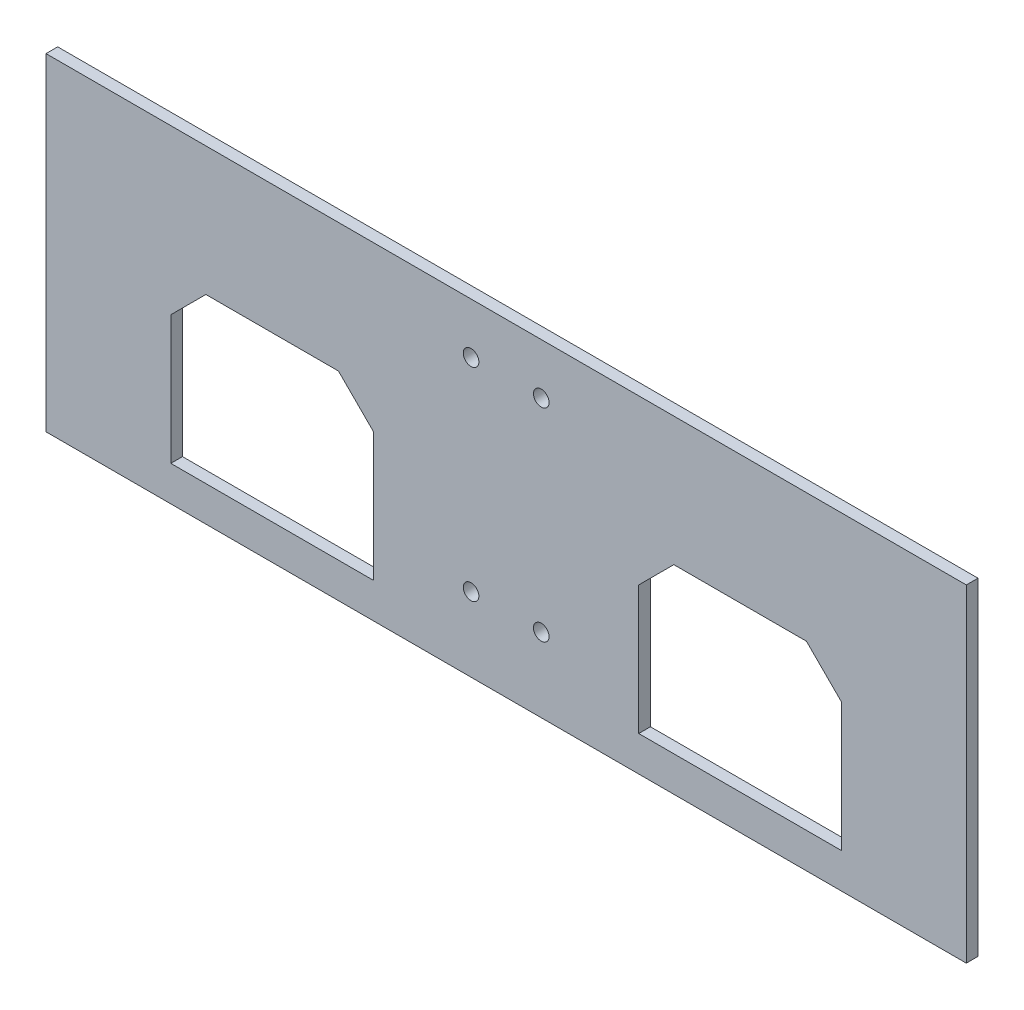
ISO-10303-21;
HEADER;
FILE_DESCRIPTION(('STEP AP214'),'2;1');
FILE_NAME('part.step','',(''),(''),'','','');
FILE_SCHEMA(('AUTOMOTIVE_DESIGN { 1 0 10303 214 1 1 1 1 }'));
ENDSEC;
DATA;
#1=APPLICATION_CONTEXT('core data for automotive mechanical design processes');
#2=APPLICATION_PROTOCOL_DEFINITION('international standard','automotive_design',2000,#1);
#3=PRODUCT_CONTEXT('',#1,'mechanical');
#4=PRODUCT('Part','Part','',(#3));
#5=PRODUCT_RELATED_PRODUCT_CATEGORY('part','',(#4));
#6=PRODUCT_DEFINITION_FORMATION('','',#4);
#7=PRODUCT_DEFINITION_CONTEXT('part definition',#1,'design');
#8=PRODUCT_DEFINITION('design','',#6,#7);
#9=PRODUCT_DEFINITION_SHAPE('','',#8);
#10=(LENGTH_UNIT() NAMED_UNIT(*) SI_UNIT(.MILLI.,.METRE.));
#11=(NAMED_UNIT(*) PLANE_ANGLE_UNIT() SI_UNIT($,.RADIAN.));
#12=(NAMED_UNIT(*) SI_UNIT($,.STERADIAN.) SOLID_ANGLE_UNIT());
#13=UNCERTAINTY_MEASURE_WITH_UNIT(LENGTH_MEASURE(1.E-05),#10,'distance_accuracy_value','');
#14=(GEOMETRIC_REPRESENTATION_CONTEXT(3) GLOBAL_UNCERTAINTY_ASSIGNED_CONTEXT((#13)) GLOBAL_UNIT_ASSIGNED_CONTEXT((#10,
#11,#12)) REPRESENTATION_CONTEXT('',''));
#15=CARTESIAN_POINT('',(0.,0.,0.));
#16=DIRECTION('',(0.,0.,1.));
#17=DIRECTION('',(1.,0.,0.));
#18=AXIS2_PLACEMENT_3D('',#15,#16,#17);
#19=CARTESIAN_POINT('',(-118.,39.,3.));
#20=DIRECTION('',(1.,0.,0.));
#21=DIRECTION('',(0.,1.,0.));
#22=AXIS2_PLACEMENT_3D('',#19,#20,#21);
#23=PLANE('',#22);
#24=DIRECTION('',(0.,-1.,0.));
#25=VECTOR('',#24,1.);
#26=CARTESIAN_POINT('',(-118.,39.,0.));
#27=LINE('',#26,#25);
#28=CARTESIAN_POINT('',(-118.,39.,0.));
#29=VERTEX_POINT('',#28);
#30=CARTESIAN_POINT('',(-118.,-45.,0.));
#31=VERTEX_POINT('',#30);
#32=EDGE_CURVE('E276',#29,#31,#27,.T.);
#33=ORIENTED_EDGE('',*,*,#32,.T.);
#34=DIRECTION('',(0.,0.,1.));
#35=VECTOR('',#34,1.);
#36=CARTESIAN_POINT('',(-118.,-45.,0.));
#37=LINE('',#36,#35);
#38=CARTESIAN_POINT('',(-118.,-45.,3.));
#39=VERTEX_POINT('',#38);
#40=EDGE_CURVE('E252',#31,#39,#37,.T.);
#41=ORIENTED_EDGE('',*,*,#40,.T.);
#42=DIRECTION('',(0.,-1.,0.));
#43=VECTOR('',#42,1.);
#44=CARTESIAN_POINT('',(-118.,39.,3.));
#45=LINE('',#44,#43);
#46=CARTESIAN_POINT('',(-118.,39.,3.));
#47=VERTEX_POINT('',#46);
#48=EDGE_CURVE('E285',#47,#39,#45,.T.);
#49=ORIENTED_EDGE('',*,*,#48,.F.);
#50=DIRECTION('',(0.,0.,-1.));
#51=VECTOR('',#50,1.);
#52=CARTESIAN_POINT('',(-118.,39.,3.));
#53=LINE('',#52,#51);
#54=EDGE_CURVE('E46',#47,#29,#53,.T.);
#55=ORIENTED_EDGE('',*,*,#54,.T.);
#56=EDGE_LOOP('',(#33,#41,#49,#55));
#57=FACE_BOUND('',#56,.T.);
#58=ADVANCED_FACE('F39',(#57),#23,.F.);
#59=CARTESIAN_POINT('',(118.,39.,3.));
#60=DIRECTION('',(-1.,0.,0.));
#61=DIRECTION('',(0.,-1.,0.));
#62=AXIS2_PLACEMENT_3D('',#59,#60,#61);
#63=PLANE('',#62);
#64=DIRECTION('',(0.,1.,0.));
#65=VECTOR('',#64,1.);
#66=CARTESIAN_POINT('',(118.,39.,0.));
#67=LINE('',#66,#65);
#68=CARTESIAN_POINT('',(118.,-45.,0.));
#69=VERTEX_POINT('',#68);
#70=CARTESIAN_POINT('',(118.,39.,0.));
#71=VERTEX_POINT('',#70);
#72=EDGE_CURVE('E293',#69,#71,#67,.T.);
#73=ORIENTED_EDGE('',*,*,#72,.T.);
#74=DIRECTION('',(0.,0.,-1.));
#75=VECTOR('',#74,1.);
#76=CARTESIAN_POINT('',(118.,39.,3.));
#77=LINE('',#76,#75);
#78=CARTESIAN_POINT('',(118.,39.,3.));
#79=VERTEX_POINT('',#78);
#80=EDGE_CURVE('E11',#79,#71,#77,.T.);
#81=ORIENTED_EDGE('',*,*,#80,.F.);
#82=DIRECTION('',(0.,1.,0.));
#83=VECTOR('',#82,1.);
#84=CARTESIAN_POINT('',(118.,39.,3.));
#85=LINE('',#84,#83);
#86=CARTESIAN_POINT('',(118.,-45.,3.));
#87=VERTEX_POINT('',#86);
#88=EDGE_CURVE('E287',#87,#79,#85,.T.);
#89=ORIENTED_EDGE('',*,*,#88,.F.);
#90=DIRECTION('',(0.,0.,1.));
#91=VECTOR('',#90,1.);
#92=CARTESIAN_POINT('',(118.,-45.,0.));
#93=LINE('',#92,#91);
#94=EDGE_CURVE('E255',#69,#87,#93,.T.);
#95=ORIENTED_EDGE('',*,*,#94,.F.);
#96=EDGE_LOOP('',(#73,#81,#89,#95));
#97=FACE_BOUND('',#96,.T.);
#98=ADVANCED_FACE('F315',(#97),#63,.F.);
#99=CARTESIAN_POINT('',(-118.,39.,3.));
#100=DIRECTION('',(0.,-1.,0.));
#101=DIRECTION('',(1.,0.,0.));
#102=AXIS2_PLACEMENT_3D('',#99,#100,#101);
#103=PLANE('',#102);
#104=DIRECTION('',(-1.,0.,0.));
#105=VECTOR('',#104,1.);
#106=CARTESIAN_POINT('',(-118.,39.,0.));
#107=LINE('',#106,#105);
#108=EDGE_CURVE('E288',#71,#29,#107,.T.);
#109=ORIENTED_EDGE('',*,*,#108,.T.);
#110=ORIENTED_EDGE('',*,*,#54,.F.);
#111=DIRECTION('',(-1.,0.,0.));
#112=VECTOR('',#111,1.);
#113=CARTESIAN_POINT('',(-118.,39.,3.));
#114=LINE('',#113,#112);
#115=EDGE_CURVE('E290',#79,#47,#114,.T.);
#116=ORIENTED_EDGE('',*,*,#115,.F.);
#117=ORIENTED_EDGE('',*,*,#80,.T.);
#118=EDGE_LOOP('',(#109,#110,#116,#117));
#119=FACE_BOUND('',#118,.T.);
#120=ADVANCED_FACE('F313',(#119),#103,.F.);
#121=CARTESIAN_POINT('',(0.,0.,3.));
#122=DIRECTION('',(0.,0.,-1.));
#123=DIRECTION('',(-1.,0.,0.));
#124=AXIS2_PLACEMENT_3D('',#121,#122,#123);
#125=PLANE('',#124);
#126=DIRECTION('',(-1.,0.,0.));
#127=VECTOR('',#126,1.);
#128=CARTESIAN_POINT('',(43.,5.99999999999998,3.));
#129=LINE('',#128,#127);
#130=CARTESIAN_POINT('',(77.,5.99999999999998,3.));
#131=VERTEX_POINT('',#130);
#132=CARTESIAN_POINT('',(43.,5.99999999999998,3.));
#133=VERTEX_POINT('',#132);
#134=EDGE_CURVE('E176',#131,#133,#129,.T.);
#135=ORIENTED_EDGE('',*,*,#134,.F.);
#136=DIRECTION('',(-0.707106781186548,0.707106781186547,0.));
#137=VECTOR('',#136,1.);
#138=CARTESIAN_POINT('',(86.,-3.,3.));
#139=LINE('',#138,#137);
#140=CARTESIAN_POINT('',(86.,-3.,3.));
#141=VERTEX_POINT('',#140);
#142=EDGE_CURVE('E53',#141,#131,#139,.T.);
#143=ORIENTED_EDGE('',*,*,#142,.F.);
#144=DIRECTION('',(0.,1.,0.));
#145=VECTOR('',#144,1.);
#146=CARTESIAN_POINT('',(86.,-36.,3.));
#147=LINE('',#146,#145);
#148=CARTESIAN_POINT('',(86.,-36.,3.));
#149=VERTEX_POINT('',#148);
#150=EDGE_CURVE('E168',#149,#141,#147,.T.);
#151=ORIENTED_EDGE('',*,*,#150,.F.);
#152=DIRECTION('',(1.,0.,0.));
#153=VECTOR('',#152,1.);
#154=CARTESIAN_POINT('',(34.,-36.,3.));
#155=LINE('',#154,#153);
#156=CARTESIAN_POINT('',(34.,-36.,3.));
#157=VERTEX_POINT('',#156);
#158=EDGE_CURVE('E189',#157,#149,#155,.T.);
#159=ORIENTED_EDGE('',*,*,#158,.F.);
#160=DIRECTION('',(0.,-1.,0.));
#161=VECTOR('',#160,1.);
#162=CARTESIAN_POINT('',(34.,-36.,3.));
#163=LINE('',#162,#161);
#164=CARTESIAN_POINT('',(34.,-3.00000000000002,3.));
#165=VERTEX_POINT('',#164);
#166=EDGE_CURVE('E186',#165,#157,#163,.T.);
#167=ORIENTED_EDGE('',*,*,#166,.F.);
#168=DIRECTION('',(-0.707106781186548,-0.707106781186547,0.));
#169=VECTOR('',#168,1.);
#170=CARTESIAN_POINT('',(34.,-3.00000000000002,3.));
#171=LINE('',#170,#169);
#172=EDGE_CURVE('E183',#133,#165,#171,.T.);
#173=ORIENTED_EDGE('',*,*,#172,.F.);
#174=EDGE_LOOP('',(#135,#143,#151,#159,#167,#173));
#175=FACE_BOUND('',#174,.T.);
#176=DIRECTION('',(-0.707106781186548,-0.707106781186547,0.));
#177=VECTOR('',#176,1.);
#178=CARTESIAN_POINT('',(-86.,-3.,3.));
#179=LINE('',#178,#177);
#180=CARTESIAN_POINT('',(-77.,5.99999999999998,3.));
#181=VERTEX_POINT('',#180);
#182=CARTESIAN_POINT('',(-86.,-3.,3.));
#183=VERTEX_POINT('',#182);
#184=EDGE_CURVE('E218',#181,#183,#179,.T.);
#185=ORIENTED_EDGE('',*,*,#184,.F.);
#186=DIRECTION('',(-1.,0.,0.));
#187=VECTOR('',#186,1.);
#188=CARTESIAN_POINT('',(-43.,5.99999999999998,3.));
#189=LINE('',#188,#187);
#190=CARTESIAN_POINT('',(-43.,5.99999999999998,3.));
#191=VERTEX_POINT('',#190);
#192=EDGE_CURVE('E61',#191,#181,#189,.T.);
#193=ORIENTED_EDGE('',*,*,#192,.F.);
#194=DIRECTION('',(-0.707106781186548,0.707106781186547,0.));
#195=VECTOR('',#194,1.);
#196=CARTESIAN_POINT('',(-34.,-3.00000000000002,3.));
#197=LINE('',#196,#195);
#198=CARTESIAN_POINT('',(-34.,-3.00000000000002,3.));
#199=VERTEX_POINT('',#198);
#200=EDGE_CURVE('E230',#199,#191,#197,.T.);
#201=ORIENTED_EDGE('',*,*,#200,.F.);
#202=DIRECTION('',(0.,1.,0.));
#203=VECTOR('',#202,1.);
#204=CARTESIAN_POINT('',(-34.,-36.,3.));
#205=LINE('',#204,#203);
#206=CARTESIAN_POINT('',(-34.,-36.,3.));
#207=VERTEX_POINT('',#206);
#208=EDGE_CURVE('E227',#207,#199,#205,.T.);
#209=ORIENTED_EDGE('',*,*,#208,.F.);
#210=DIRECTION('',(1.,0.,0.));
#211=VECTOR('',#210,1.);
#212=CARTESIAN_POINT('',(-34.,-36.,3.));
#213=LINE('',#212,#211);
#214=CARTESIAN_POINT('',(-86.,-36.,3.));
#215=VERTEX_POINT('',#214);
#216=EDGE_CURVE('E224',#215,#207,#213,.T.);
#217=ORIENTED_EDGE('',*,*,#216,.F.);
#218=DIRECTION('',(0.,-1.,0.));
#219=VECTOR('',#218,1.);
#220=CARTESIAN_POINT('',(-86.,-36.,3.));
#221=LINE('',#220,#219);
#222=EDGE_CURVE('E221',#183,#215,#221,.T.);
#223=ORIENTED_EDGE('',*,*,#222,.F.);
#224=EDGE_LOOP('',(#185,#193,#201,#209,#217,#223));
#225=FACE_BOUND('',#224,.T.);
#226=CARTESIAN_POINT('',(9.,26.,3.));
#227=DIRECTION('',(0.,0.,-1.));
#228=DIRECTION('',(1.,0.,0.));
#229=AXIS2_PLACEMENT_3D('',#226,#227,#228);
#230=CIRCLE('',#229,2.);
#231=CARTESIAN_POINT('',(11.,26.,3.));
#232=VERTEX_POINT('',#231);
#233=EDGE_CURVE('E261',#232,#232,#230,.T.);
#234=ORIENTED_EDGE('',*,*,#233,.T.);
#235=EDGE_LOOP('',(#234));
#236=FACE_BOUND('',#235,.T.);
#237=CARTESIAN_POINT('',(-9.,26.,3.));
#238=DIRECTION('',(0.,0.,-1.));
#239=DIRECTION('',(1.,0.,0.));
#240=AXIS2_PLACEMENT_3D('',#237,#238,#239);
#241=CIRCLE('',#240,2.);
#242=CARTESIAN_POINT('',(-7.,26.,3.));
#243=VERTEX_POINT('',#242);
#244=EDGE_CURVE('E258',#243,#243,#241,.T.);
#245=ORIENTED_EDGE('',*,*,#244,.T.);
#246=EDGE_LOOP('',(#245));
#247=FACE_BOUND('',#246,.T.);
#248=CARTESIAN_POINT('',(9.,-26.,3.));
#249=DIRECTION('',(0.,0.,1.));
#250=DIRECTION('',(1.,0.,0.));
#251=AXIS2_PLACEMENT_3D('',#248,#249,#250);
#252=CIRCLE('',#251,2.);
#253=CARTESIAN_POINT('',(11.,-26.,3.));
#254=VERTEX_POINT('',#253);
#255=EDGE_CURVE('E273',#254,#254,#252,.T.);
#256=ORIENTED_EDGE('',*,*,#255,.F.);
#257=EDGE_LOOP('',(#256));
#258=FACE_BOUND('',#257,.T.);
#259=CARTESIAN_POINT('',(-9.,-26.,3.));
#260=DIRECTION('',(0.,0.,1.));
#261=DIRECTION('',(1.,0.,0.));
#262=AXIS2_PLACEMENT_3D('',#259,#260,#261);
#263=CIRCLE('',#262,2.);
#264=CARTESIAN_POINT('',(-7.,-26.,3.));
#265=VERTEX_POINT('',#264);
#266=EDGE_CURVE('E280',#265,#265,#263,.T.);
#267=ORIENTED_EDGE('',*,*,#266,.F.);
#268=EDGE_LOOP('',(#267));
#269=FACE_BOUND('',#268,.T.);
#270=ORIENTED_EDGE('',*,*,#48,.T.);
#271=DIRECTION('',(1.,0.,0.));
#272=VECTOR('',#271,1.);
#273=CARTESIAN_POINT('',(-118.,-45.,3.));
#274=LINE('',#273,#272);
#275=EDGE_CURVE('E162',#39,#87,#274,.T.);
#276=ORIENTED_EDGE('',*,*,#275,.T.);
#277=ORIENTED_EDGE('',*,*,#88,.T.);
#278=ORIENTED_EDGE('',*,*,#115,.T.);
#279=EDGE_LOOP('',(#270,#276,#277,#278));
#280=FACE_BOUND('',#279,.T.);
#281=ADVANCED_FACE('F311',(#175,#225,#236,#247,#258,#269,#280),#125,.F.);
#282=CARTESIAN_POINT('',(0.,0.,0.));
#283=DIRECTION('',(0.,0.,-1.));
#284=DIRECTION('',(-1.,0.,0.));
#285=AXIS2_PLACEMENT_3D('',#282,#283,#284);
#286=PLANE('',#285);
#287=DIRECTION('',(-0.707106781186548,0.707106781186547,0.));
#288=VECTOR('',#287,1.);
#289=CARTESIAN_POINT('',(86.,-3.,0.));
#290=LINE('',#289,#288);
#291=CARTESIAN_POINT('',(86.,-3.,0.));
#292=VERTEX_POINT('',#291);
#293=CARTESIAN_POINT('',(77.,5.99999999999998,0.));
#294=VERTEX_POINT('',#293);
#295=EDGE_CURVE('E166',#292,#294,#290,.T.);
#296=ORIENTED_EDGE('',*,*,#295,.T.);
#297=DIRECTION('',(-1.,0.,0.));
#298=VECTOR('',#297,1.);
#299=CARTESIAN_POINT('',(43.,5.99999999999998,0.));
#300=LINE('',#299,#298);
#301=CARTESIAN_POINT('',(43.,5.99999999999998,0.));
#302=VERTEX_POINT('',#301);
#303=EDGE_CURVE('E152',#294,#302,#300,.T.);
#304=ORIENTED_EDGE('',*,*,#303,.T.);
#305=DIRECTION('',(-0.707106781186548,-0.707106781186547,0.));
#306=VECTOR('',#305,1.);
#307=CARTESIAN_POINT('',(34.,-3.00000000000002,0.));
#308=LINE('',#307,#306);
#309=CARTESIAN_POINT('',(34.,-3.00000000000002,0.));
#310=VERTEX_POINT('',#309);
#311=EDGE_CURVE('E248',#302,#310,#308,.T.);
#312=ORIENTED_EDGE('',*,*,#311,.T.);
#313=DIRECTION('',(0.,-1.,0.));
#314=VECTOR('',#313,1.);
#315=CARTESIAN_POINT('',(34.,-36.,0.));
#316=LINE('',#315,#314);
#317=CARTESIAN_POINT('',(34.,-36.,0.));
#318=VERTEX_POINT('',#317);
#319=EDGE_CURVE('E399',#310,#318,#316,.T.);
#320=ORIENTED_EDGE('',*,*,#319,.T.);
#321=DIRECTION('',(1.,0.,0.));
#322=VECTOR('',#321,1.);
#323=CARTESIAN_POINT('',(34.,-36.,0.));
#324=LINE('',#323,#322);
#325=CARTESIAN_POINT('',(86.,-36.,0.));
#326=VERTEX_POINT('',#325);
#327=EDGE_CURVE('E178',#318,#326,#324,.T.);
#328=ORIENTED_EDGE('',*,*,#327,.T.);
#329=DIRECTION('',(0.,1.,0.));
#330=VECTOR('',#329,1.);
#331=CARTESIAN_POINT('',(86.,-36.,0.));
#332=LINE('',#331,#330);
#333=EDGE_CURVE('E174',#326,#292,#332,.T.);
#334=ORIENTED_EDGE('',*,*,#333,.T.);
#335=EDGE_LOOP('',(#296,#304,#312,#320,#328,#334));
#336=FACE_BOUND('',#335,.T.);
#337=DIRECTION('',(-1.,0.,0.));
#338=VECTOR('',#337,1.);
#339=CARTESIAN_POINT('',(-43.,5.99999999999998,0.));
#340=LINE('',#339,#338);
#341=CARTESIAN_POINT('',(-43.,5.99999999999998,0.));
#342=VERTEX_POINT('',#341);
#343=CARTESIAN_POINT('',(-77.,5.99999999999998,0.));
#344=VERTEX_POINT('',#343);
#345=EDGE_CURVE('E214',#342,#344,#340,.T.);
#346=ORIENTED_EDGE('',*,*,#345,.T.);
#347=DIRECTION('',(-0.707106781186548,-0.707106781186547,0.));
#348=VECTOR('',#347,1.);
#349=CARTESIAN_POINT('',(-86.,-3.,0.));
#350=LINE('',#349,#348);
#351=CARTESIAN_POINT('',(-86.,-3.,0.));
#352=VERTEX_POINT('',#351);
#353=EDGE_CURVE('E236',#344,#352,#350,.T.);
#354=ORIENTED_EDGE('',*,*,#353,.T.);
#355=DIRECTION('',(0.,-1.,0.));
#356=VECTOR('',#355,1.);
#357=CARTESIAN_POINT('',(-86.,-36.,0.));
#358=LINE('',#357,#356);
#359=CARTESIAN_POINT('',(-86.,-36.,0.));
#360=VERTEX_POINT('',#359);
#361=EDGE_CURVE('E202',#352,#360,#358,.T.);
#362=ORIENTED_EDGE('',*,*,#361,.T.);
#363=DIRECTION('',(1.,0.,0.));
#364=VECTOR('',#363,1.);
#365=CARTESIAN_POINT('',(-34.,-36.,0.));
#366=LINE('',#365,#364);
#367=CARTESIAN_POINT('',(-34.,-36.,0.));
#368=VERTEX_POINT('',#367);
#369=EDGE_CURVE('E205',#360,#368,#366,.T.);
#370=ORIENTED_EDGE('',*,*,#369,.T.);
#371=DIRECTION('',(0.,1.,0.));
#372=VECTOR('',#371,1.);
#373=CARTESIAN_POINT('',(-34.,-36.,0.));
#374=LINE('',#373,#372);
#375=CARTESIAN_POINT('',(-34.,-3.00000000000002,0.));
#376=VERTEX_POINT('',#375);
#377=EDGE_CURVE('E208',#368,#376,#374,.T.);
#378=ORIENTED_EDGE('',*,*,#377,.T.);
#379=DIRECTION('',(-0.707106781186548,0.707106781186547,0.));
#380=VECTOR('',#379,1.);
#381=CARTESIAN_POINT('',(-34.,-3.00000000000002,0.));
#382=LINE('',#381,#380);
#383=EDGE_CURVE('E211',#376,#342,#382,.T.);
#384=ORIENTED_EDGE('',*,*,#383,.T.);
#385=EDGE_LOOP('',(#346,#354,#362,#370,#378,#384));
#386=FACE_BOUND('',#385,.T.);
#387=CARTESIAN_POINT('',(9.,26.,0.));
#388=DIRECTION('',(0.,0.,-1.));
#389=DIRECTION('',(-1.,0.,0.));
#390=AXIS2_PLACEMENT_3D('',#387,#388,#389);
#391=CIRCLE('',#390,2.);
#392=CARTESIAN_POINT('',(11.,26.,0.));
#393=VERTEX_POINT('',#392);
#394=EDGE_CURVE('E264',#393,#393,#391,.T.);
#395=ORIENTED_EDGE('',*,*,#394,.F.);
#396=EDGE_LOOP('',(#395));
#397=FACE_BOUND('',#396,.T.);
#398=CARTESIAN_POINT('',(-9.,26.,0.));
#399=DIRECTION('',(0.,0.,-1.));
#400=DIRECTION('',(-1.,0.,0.));
#401=AXIS2_PLACEMENT_3D('',#398,#399,#400);
#402=CIRCLE('',#401,2.);
#403=CARTESIAN_POINT('',(-7.,26.,0.));
#404=VERTEX_POINT('',#403);
#405=EDGE_CURVE('E265',#404,#404,#402,.T.);
#406=ORIENTED_EDGE('',*,*,#405,.F.);
#407=EDGE_LOOP('',(#406));
#408=FACE_BOUND('',#407,.T.);
#409=CARTESIAN_POINT('',(9.,-26.,0.));
#410=DIRECTION('',(0.,0.,-1.));
#411=DIRECTION('',(-1.,0.,0.));
#412=AXIS2_PLACEMENT_3D('',#409,#410,#411);
#413=CIRCLE('',#412,2.);
#414=CARTESIAN_POINT('',(11.,-26.,0.));
#415=VERTEX_POINT('',#414);
#416=EDGE_CURVE('E277',#415,#415,#413,.F.);
#417=ORIENTED_EDGE('',*,*,#416,.T.);
#418=EDGE_LOOP('',(#417));
#419=FACE_BOUND('',#418,.T.);
#420=CARTESIAN_POINT('',(-9.,-26.,0.));
#421=DIRECTION('',(0.,0.,-1.));
#422=DIRECTION('',(-1.,0.,0.));
#423=AXIS2_PLACEMENT_3D('',#420,#421,#422);
#424=CIRCLE('',#423,2.);
#425=CARTESIAN_POINT('',(-7.,-26.,0.));
#426=VERTEX_POINT('',#425);
#427=EDGE_CURVE('E268',#426,#426,#424,.F.);
#428=ORIENTED_EDGE('',*,*,#427,.T.);
#429=EDGE_LOOP('',(#428));
#430=FACE_BOUND('',#429,.T.);
#431=ORIENTED_EDGE('',*,*,#32,.F.);
#432=ORIENTED_EDGE('',*,*,#108,.F.);
#433=ORIENTED_EDGE('',*,*,#72,.F.);
#434=DIRECTION('',(1.,0.,0.));
#435=VECTOR('',#434,1.);
#436=CARTESIAN_POINT('',(-118.,-45.,0.));
#437=LINE('',#436,#435);
#438=EDGE_CURVE('E249',#31,#69,#437,.T.);
#439=ORIENTED_EDGE('',*,*,#438,.F.);
#440=EDGE_LOOP('',(#431,#432,#433,#439));
#441=FACE_BOUND('',#440,.T.);
#442=ADVANCED_FACE('F171',(#336,#386,#397,#408,#419,#430,#441),#286,.T.);
#443=CARTESIAN_POINT('',(-9.,-26.,-0.00100000000000013));
#444=DIRECTION('',(0.,0.,1.));
#445=DIRECTION('',(1.,0.,0.));
#446=AXIS2_PLACEMENT_3D('',#443,#444,#445);
#447=CYLINDRICAL_SURFACE('',#446,2.);
#448=CARTESIAN_POINT('',(-7.,-26.,0.));
#449=CARTESIAN_POINT('',(-7.,-26.,0.03125));
#450=CARTESIAN_POINT('',(-7.,-26.,0.0625));
#451=CARTESIAN_POINT('',(-7.,-26.,0.125));
#452=CARTESIAN_POINT('',(-7.,-26.,0.15625));
#453=CARTESIAN_POINT('',(-7.,-26.,0.21875));
#454=CARTESIAN_POINT('',(-7.,-26.,0.25));
#455=CARTESIAN_POINT('',(-7.,-26.,0.3125));
#456=CARTESIAN_POINT('',(-7.,-26.,0.34375));
#457=CARTESIAN_POINT('',(-7.,-26.,0.40625));
#458=CARTESIAN_POINT('',(-7.,-26.,0.4375));
#459=CARTESIAN_POINT('',(-7.,-26.,0.5));
#460=CARTESIAN_POINT('',(-7.,-26.,0.53125));
#461=CARTESIAN_POINT('',(-7.,-26.,0.59375));
#462=CARTESIAN_POINT('',(-7.,-26.,0.625));
#463=CARTESIAN_POINT('',(-7.,-26.,0.6875));
#464=CARTESIAN_POINT('',(-7.,-26.,0.71875));
#465=CARTESIAN_POINT('',(-7.,-26.,0.78125));
#466=CARTESIAN_POINT('',(-7.,-26.,0.8125));
#467=CARTESIAN_POINT('',(-7.,-26.,0.875));
#468=CARTESIAN_POINT('',(-7.,-26.,0.90625));
#469=CARTESIAN_POINT('',(-7.,-26.,0.96875));
#470=CARTESIAN_POINT('',(-7.,-26.,1.));
#471=CARTESIAN_POINT('',(-7.,-26.,1.0625));
#472=CARTESIAN_POINT('',(-7.,-26.,1.09375));
#473=CARTESIAN_POINT('',(-7.,-26.,1.15625));
#474=CARTESIAN_POINT('',(-7.,-26.,1.1875));
#475=CARTESIAN_POINT('',(-7.,-26.,1.25));
#476=CARTESIAN_POINT('',(-7.,-26.,1.28125));
#477=CARTESIAN_POINT('',(-7.,-26.,1.34375));
#478=CARTESIAN_POINT('',(-7.,-26.,1.375));
#479=CARTESIAN_POINT('',(-7.,-26.,1.4375));
#480=CARTESIAN_POINT('',(-7.,-26.,1.46875));
#481=CARTESIAN_POINT('',(-7.,-26.,1.53125));
#482=CARTESIAN_POINT('',(-7.,-26.,1.5625));
#483=CARTESIAN_POINT('',(-7.,-26.,1.625));
#484=CARTESIAN_POINT('',(-7.,-26.,1.65625));
#485=CARTESIAN_POINT('',(-7.,-26.,1.71875));
#486=CARTESIAN_POINT('',(-7.,-26.,1.75));
#487=CARTESIAN_POINT('',(-7.,-26.,1.8125));
#488=CARTESIAN_POINT('',(-7.,-26.,1.84375));
#489=CARTESIAN_POINT('',(-7.,-26.,1.90625));
#490=CARTESIAN_POINT('',(-7.,-26.,1.9375));
#491=CARTESIAN_POINT('',(-7.,-26.,2.));
#492=CARTESIAN_POINT('',(-7.,-26.,2.03125));
#493=CARTESIAN_POINT('',(-7.,-26.,2.09375));
#494=CARTESIAN_POINT('',(-7.,-26.,2.125));
#495=CARTESIAN_POINT('',(-7.,-26.,2.1875));
#496=CARTESIAN_POINT('',(-7.,-26.,2.21875));
#497=CARTESIAN_POINT('',(-7.,-26.,2.28125));
#498=CARTESIAN_POINT('',(-7.,-26.,2.3125));
#499=CARTESIAN_POINT('',(-7.,-26.,2.375));
#500=CARTESIAN_POINT('',(-7.,-26.,2.40625));
#501=CARTESIAN_POINT('',(-7.,-26.,2.46875));
#502=CARTESIAN_POINT('',(-7.,-26.,2.5));
#503=CARTESIAN_POINT('',(-7.,-26.,2.5625));
#504=CARTESIAN_POINT('',(-7.,-26.,2.59375));
#505=CARTESIAN_POINT('',(-7.,-26.,2.65625));
#506=CARTESIAN_POINT('',(-7.,-26.,2.6875));
#507=CARTESIAN_POINT('',(-7.,-26.,2.75));
#508=CARTESIAN_POINT('',(-7.,-26.,2.78125));
#509=CARTESIAN_POINT('',(-7.,-26.,2.84375));
#510=CARTESIAN_POINT('',(-7.,-26.,2.875));
#511=CARTESIAN_POINT('',(-7.,-26.,2.9375));
#512=CARTESIAN_POINT('',(-7.,-26.,2.96875));
#513=CARTESIAN_POINT('',(-7.,-26.,3.));
#514=B_SPLINE_CURVE_WITH_KNOTS('',3,(#448,#449,#450,#451,#452,#453,#454,#455,#456,#457,#458,
#459,#460,#461,#462,#463,#464,#465,#466,#467,#468,#469,#470,#471,#472,#473,#474,#475,#476,#477,
#478,#479,#480,#481,#482,#483,#484,#485,#486,#487,#488,#489,#490,#491,#492,#493,#494,#495,#496,
#497,#498,#499,#500,#501,#502,#503,#504,#505,#506,#507,#508,#509,#510,#511,#512,#513),
.UNSPECIFIED.,.F.,.F.,(4,2,2,2,2,2,2,2,2,2,2,2,2,2,2,2,2,2,2,2,2,2,2,2,2,2,2,2,2,2,2,2,4),(0.,
0.09375,0.1875,0.28125,0.375,0.46875,0.5625,0.65625,0.75,0.84375,0.9375,1.03125,1.125,1.21875,
1.3125,1.40625,1.5,1.59375,1.6875,1.78125,1.875,1.96875,2.0625,2.15625,2.25,2.34375,2.4375,
2.53125,2.625,2.71875,2.8125,2.90625,3.),.UNSPECIFIED.);
#515=EDGE_CURVE('BSEAM325',#426,#265,#514,.T.);
#516=ORIENTED_EDGE('',*,*,#427,.F.);
#517=ORIENTED_EDGE('',*,*,#266,.T.);
#518=ORIENTED_EDGE('',*,*,#515,.T.);
#519=ORIENTED_EDGE('',*,*,#515,.F.);
#520=EDGE_LOOP('',(#516,#518,#517,#519));
#521=FACE_BOUND('',#520,.T.);
#522=ADVANCED_FACE('F325',(#521),#447,.F.);
#523=CARTESIAN_POINT('',(9.,-26.,-0.00100000000000013));
#524=DIRECTION('',(0.,0.,1.));
#525=DIRECTION('',(1.,0.,0.));
#526=AXIS2_PLACEMENT_3D('',#523,#524,#525);
#527=CYLINDRICAL_SURFACE('',#526,2.);
#528=CARTESIAN_POINT('',(11.,-26.,0.));
#529=CARTESIAN_POINT('',(11.,-26.,0.03125));
#530=CARTESIAN_POINT('',(11.,-26.,0.0625));
#531=CARTESIAN_POINT('',(11.,-26.,0.125));
#532=CARTESIAN_POINT('',(11.,-26.,0.15625));
#533=CARTESIAN_POINT('',(11.,-26.,0.21875));
#534=CARTESIAN_POINT('',(11.,-26.,0.25));
#535=CARTESIAN_POINT('',(11.,-26.,0.3125));
#536=CARTESIAN_POINT('',(11.,-26.,0.34375));
#537=CARTESIAN_POINT('',(11.,-26.,0.40625));
#538=CARTESIAN_POINT('',(11.,-26.,0.4375));
#539=CARTESIAN_POINT('',(11.,-26.,0.5));
#540=CARTESIAN_POINT('',(11.,-26.,0.53125));
#541=CARTESIAN_POINT('',(11.,-26.,0.59375));
#542=CARTESIAN_POINT('',(11.,-26.,0.625));
#543=CARTESIAN_POINT('',(11.,-26.,0.6875));
#544=CARTESIAN_POINT('',(11.,-26.,0.71875));
#545=CARTESIAN_POINT('',(11.,-26.,0.78125));
#546=CARTESIAN_POINT('',(11.,-26.,0.8125));
#547=CARTESIAN_POINT('',(11.,-26.,0.875));
#548=CARTESIAN_POINT('',(11.,-26.,0.90625));
#549=CARTESIAN_POINT('',(11.,-26.,0.96875));
#550=CARTESIAN_POINT('',(11.,-26.,1.));
#551=CARTESIAN_POINT('',(11.,-26.,1.0625));
#552=CARTESIAN_POINT('',(11.,-26.,1.09375));
#553=CARTESIAN_POINT('',(11.,-26.,1.15625));
#554=CARTESIAN_POINT('',(11.,-26.,1.1875));
#555=CARTESIAN_POINT('',(11.,-26.,1.25));
#556=CARTESIAN_POINT('',(11.,-26.,1.28125));
#557=CARTESIAN_POINT('',(11.,-26.,1.34375));
#558=CARTESIAN_POINT('',(11.,-26.,1.375));
#559=CARTESIAN_POINT('',(11.,-26.,1.4375));
#560=CARTESIAN_POINT('',(11.,-26.,1.46875));
#561=CARTESIAN_POINT('',(11.,-26.,1.53125));
#562=CARTESIAN_POINT('',(11.,-26.,1.5625));
#563=CARTESIAN_POINT('',(11.,-26.,1.625));
#564=CARTESIAN_POINT('',(11.,-26.,1.65625));
#565=CARTESIAN_POINT('',(11.,-26.,1.71875));
#566=CARTESIAN_POINT('',(11.,-26.,1.75));
#567=CARTESIAN_POINT('',(11.,-26.,1.8125));
#568=CARTESIAN_POINT('',(11.,-26.,1.84375));
#569=CARTESIAN_POINT('',(11.,-26.,1.90625));
#570=CARTESIAN_POINT('',(11.,-26.,1.9375));
#571=CARTESIAN_POINT('',(11.,-26.,2.));
#572=CARTESIAN_POINT('',(11.,-26.,2.03125));
#573=CARTESIAN_POINT('',(11.,-26.,2.09375));
#574=CARTESIAN_POINT('',(11.,-26.,2.125));
#575=CARTESIAN_POINT('',(11.,-26.,2.1875));
#576=CARTESIAN_POINT('',(11.,-26.,2.21875));
#577=CARTESIAN_POINT('',(11.,-26.,2.28125));
#578=CARTESIAN_POINT('',(11.,-26.,2.3125));
#579=CARTESIAN_POINT('',(11.,-26.,2.375));
#580=CARTESIAN_POINT('',(11.,-26.,2.40625));
#581=CARTESIAN_POINT('',(11.,-26.,2.46875));
#582=CARTESIAN_POINT('',(11.,-26.,2.5));
#583=CARTESIAN_POINT('',(11.,-26.,2.5625));
#584=CARTESIAN_POINT('',(11.,-26.,2.59375));
#585=CARTESIAN_POINT('',(11.,-26.,2.65625));
#586=CARTESIAN_POINT('',(11.,-26.,2.6875));
#587=CARTESIAN_POINT('',(11.,-26.,2.75));
#588=CARTESIAN_POINT('',(11.,-26.,2.78125));
#589=CARTESIAN_POINT('',(11.,-26.,2.84375));
#590=CARTESIAN_POINT('',(11.,-26.,2.875));
#591=CARTESIAN_POINT('',(11.,-26.,2.9375));
#592=CARTESIAN_POINT('',(11.,-26.,2.96875));
#593=CARTESIAN_POINT('',(11.,-26.,3.));
#594=B_SPLINE_CURVE_WITH_KNOTS('',3,(#528,#529,#530,#531,#532,#533,#534,#535,#536,#537,#538,
#539,#540,#541,#542,#543,#544,#545,#546,#547,#548,#549,#550,#551,#552,#553,#554,#555,#556,#557,
#558,#559,#560,#561,#562,#563,#564,#565,#566,#567,#568,#569,#570,#571,#572,#573,#574,#575,#576,
#577,#578,#579,#580,#581,#582,#583,#584,#585,#586,#587,#588,#589,#590,#591,#592,#593),
.UNSPECIFIED.,.F.,.F.,(4,2,2,2,2,2,2,2,2,2,2,2,2,2,2,2,2,2,2,2,2,2,2,2,2,2,2,2,2,2,2,2,4),(0.,
0.09375,0.1875,0.28125,0.375,0.46875,0.5625,0.65625,0.75,0.84375,0.9375,1.03125,1.125,1.21875,
1.3125,1.40625,1.5,1.59375,1.6875,1.78125,1.875,1.96875,2.0625,2.15625,2.25,2.34375,2.4375,
2.53125,2.625,2.71875,2.8125,2.90625,3.),.UNSPECIFIED.);
#595=EDGE_CURVE('BSEAM331',#415,#254,#594,.T.);
#596=ORIENTED_EDGE('',*,*,#416,.F.);
#597=ORIENTED_EDGE('',*,*,#255,.T.);
#598=ORIENTED_EDGE('',*,*,#595,.T.);
#599=ORIENTED_EDGE('',*,*,#595,.F.);
#600=EDGE_LOOP('',(#596,#598,#597,#599));
#601=FACE_BOUND('',#600,.T.);
#602=ADVANCED_FACE('F331',(#601),#527,.F.);
#603=CARTESIAN_POINT('',(-9.,26.,-0.00100000000000013));
#604=DIRECTION('',(0.,0.,1.));
#605=DIRECTION('',(1.,0.,0.));
#606=AXIS2_PLACEMENT_3D('',#603,#604,#605);
#607=CYLINDRICAL_SURFACE('',#606,2.);
#608=CARTESIAN_POINT('',(-7.,26.,0.));
#609=CARTESIAN_POINT('',(-7.,26.,0.03125));
#610=CARTESIAN_POINT('',(-7.,26.,0.0625));
#611=CARTESIAN_POINT('',(-7.,26.,0.125));
#612=CARTESIAN_POINT('',(-7.,26.,0.15625));
#613=CARTESIAN_POINT('',(-7.,26.,0.21875));
#614=CARTESIAN_POINT('',(-7.,26.,0.25));
#615=CARTESIAN_POINT('',(-7.,26.,0.3125));
#616=CARTESIAN_POINT('',(-7.,26.,0.34375));
#617=CARTESIAN_POINT('',(-7.,26.,0.40625));
#618=CARTESIAN_POINT('',(-7.,26.,0.4375));
#619=CARTESIAN_POINT('',(-7.,26.,0.5));
#620=CARTESIAN_POINT('',(-7.,26.,0.53125));
#621=CARTESIAN_POINT('',(-7.,26.,0.59375));
#622=CARTESIAN_POINT('',(-7.,26.,0.625));
#623=CARTESIAN_POINT('',(-7.,26.,0.6875));
#624=CARTESIAN_POINT('',(-7.,26.,0.71875));
#625=CARTESIAN_POINT('',(-7.,26.,0.78125));
#626=CARTESIAN_POINT('',(-7.,26.,0.8125));
#627=CARTESIAN_POINT('',(-7.,26.,0.875));
#628=CARTESIAN_POINT('',(-7.,26.,0.90625));
#629=CARTESIAN_POINT('',(-7.,26.,0.96875));
#630=CARTESIAN_POINT('',(-7.,26.,1.));
#631=CARTESIAN_POINT('',(-7.,26.,1.0625));
#632=CARTESIAN_POINT('',(-7.,26.,1.09375));
#633=CARTESIAN_POINT('',(-7.,26.,1.15625));
#634=CARTESIAN_POINT('',(-7.,26.,1.1875));
#635=CARTESIAN_POINT('',(-7.,26.,1.25));
#636=CARTESIAN_POINT('',(-7.,26.,1.28125));
#637=CARTESIAN_POINT('',(-7.,26.,1.34375));
#638=CARTESIAN_POINT('',(-7.,26.,1.375));
#639=CARTESIAN_POINT('',(-7.,26.,1.4375));
#640=CARTESIAN_POINT('',(-7.,26.,1.46875));
#641=CARTESIAN_POINT('',(-7.,26.,1.53125));
#642=CARTESIAN_POINT('',(-7.,26.,1.5625));
#643=CARTESIAN_POINT('',(-7.,26.,1.625));
#644=CARTESIAN_POINT('',(-7.,26.,1.65625));
#645=CARTESIAN_POINT('',(-7.,26.,1.71875));
#646=CARTESIAN_POINT('',(-7.,26.,1.75));
#647=CARTESIAN_POINT('',(-7.,26.,1.8125));
#648=CARTESIAN_POINT('',(-7.,26.,1.84375));
#649=CARTESIAN_POINT('',(-7.,26.,1.90625));
#650=CARTESIAN_POINT('',(-7.,26.,1.9375));
#651=CARTESIAN_POINT('',(-7.,26.,2.));
#652=CARTESIAN_POINT('',(-7.,26.,2.03125));
#653=CARTESIAN_POINT('',(-7.,26.,2.09375));
#654=CARTESIAN_POINT('',(-7.,26.,2.125));
#655=CARTESIAN_POINT('',(-7.,26.,2.1875));
#656=CARTESIAN_POINT('',(-7.,26.,2.21875));
#657=CARTESIAN_POINT('',(-7.,26.,2.28125));
#658=CARTESIAN_POINT('',(-7.,26.,2.3125));
#659=CARTESIAN_POINT('',(-7.,26.,2.375));
#660=CARTESIAN_POINT('',(-7.,26.,2.40625));
#661=CARTESIAN_POINT('',(-7.,26.,2.46875));
#662=CARTESIAN_POINT('',(-7.,26.,2.5));
#663=CARTESIAN_POINT('',(-7.,26.,2.5625));
#664=CARTESIAN_POINT('',(-7.,26.,2.59375));
#665=CARTESIAN_POINT('',(-7.,26.,2.65625));
#666=CARTESIAN_POINT('',(-7.,26.,2.6875));
#667=CARTESIAN_POINT('',(-7.,26.,2.75));
#668=CARTESIAN_POINT('',(-7.,26.,2.78125));
#669=CARTESIAN_POINT('',(-7.,26.,2.84375));
#670=CARTESIAN_POINT('',(-7.,26.,2.875));
#671=CARTESIAN_POINT('',(-7.,26.,2.9375));
#672=CARTESIAN_POINT('',(-7.,26.,2.96875));
#673=CARTESIAN_POINT('',(-7.,26.,3.));
#674=B_SPLINE_CURVE_WITH_KNOTS('',3,(#608,#609,#610,#611,#612,#613,#614,#615,#616,#617,#618,
#619,#620,#621,#622,#623,#624,#625,#626,#627,#628,#629,#630,#631,#632,#633,#634,#635,#636,#637,
#638,#639,#640,#641,#642,#643,#644,#645,#646,#647,#648,#649,#650,#651,#652,#653,#654,#655,#656,
#657,#658,#659,#660,#661,#662,#663,#664,#665,#666,#667,#668,#669,#670,#671,#672,#673),
.UNSPECIFIED.,.F.,.F.,(4,2,2,2,2,2,2,2,2,2,2,2,2,2,2,2,2,2,2,2,2,2,2,2,2,2,2,2,2,2,2,2,4),(0.,
0.09375,0.1875,0.28125,0.375,0.46875,0.5625,0.65625,0.75,0.84375,0.9375,1.03125,1.125,1.21875,
1.3125,1.40625,1.5,1.59375,1.6875,1.78125,1.875,1.96875,2.0625,2.15625,2.25,2.34375,2.4375,
2.53125,2.625,2.71875,2.8125,2.90625,3.),.UNSPECIFIED.);
#675=EDGE_CURVE('BSEAM335',#404,#243,#674,.T.);
#676=ORIENTED_EDGE('',*,*,#405,.T.);
#677=ORIENTED_EDGE('',*,*,#244,.F.);
#678=ORIENTED_EDGE('',*,*,#675,.T.);
#679=ORIENTED_EDGE('',*,*,#675,.F.);
#680=EDGE_LOOP('',(#676,#678,#677,#679));
#681=FACE_BOUND('',#680,.T.);
#682=ADVANCED_FACE('F335',(#681),#607,.F.);
#683=CARTESIAN_POINT('',(9.,26.,-0.00100000000000013));
#684=DIRECTION('',(0.,0.,1.));
#685=DIRECTION('',(1.,0.,0.));
#686=AXIS2_PLACEMENT_3D('',#683,#684,#685);
#687=CYLINDRICAL_SURFACE('',#686,2.);
#688=CARTESIAN_POINT('',(11.,26.,0.));
#689=CARTESIAN_POINT('',(11.,26.,0.03125));
#690=CARTESIAN_POINT('',(11.,26.,0.0625));
#691=CARTESIAN_POINT('',(11.,26.,0.125));
#692=CARTESIAN_POINT('',(11.,26.,0.15625));
#693=CARTESIAN_POINT('',(11.,26.,0.21875));
#694=CARTESIAN_POINT('',(11.,26.,0.25));
#695=CARTESIAN_POINT('',(11.,26.,0.3125));
#696=CARTESIAN_POINT('',(11.,26.,0.34375));
#697=CARTESIAN_POINT('',(11.,26.,0.40625));
#698=CARTESIAN_POINT('',(11.,26.,0.4375));
#699=CARTESIAN_POINT('',(11.,26.,0.5));
#700=CARTESIAN_POINT('',(11.,26.,0.53125));
#701=CARTESIAN_POINT('',(11.,26.,0.59375));
#702=CARTESIAN_POINT('',(11.,26.,0.625));
#703=CARTESIAN_POINT('',(11.,26.,0.6875));
#704=CARTESIAN_POINT('',(11.,26.,0.71875));
#705=CARTESIAN_POINT('',(11.,26.,0.78125));
#706=CARTESIAN_POINT('',(11.,26.,0.8125));
#707=CARTESIAN_POINT('',(11.,26.,0.875));
#708=CARTESIAN_POINT('',(11.,26.,0.90625));
#709=CARTESIAN_POINT('',(11.,26.,0.96875));
#710=CARTESIAN_POINT('',(11.,26.,1.));
#711=CARTESIAN_POINT('',(11.,26.,1.0625));
#712=CARTESIAN_POINT('',(11.,26.,1.09375));
#713=CARTESIAN_POINT('',(11.,26.,1.15625));
#714=CARTESIAN_POINT('',(11.,26.,1.1875));
#715=CARTESIAN_POINT('',(11.,26.,1.25));
#716=CARTESIAN_POINT('',(11.,26.,1.28125));
#717=CARTESIAN_POINT('',(11.,26.,1.34375));
#718=CARTESIAN_POINT('',(11.,26.,1.375));
#719=CARTESIAN_POINT('',(11.,26.,1.4375));
#720=CARTESIAN_POINT('',(11.,26.,1.46875));
#721=CARTESIAN_POINT('',(11.,26.,1.53125));
#722=CARTESIAN_POINT('',(11.,26.,1.5625));
#723=CARTESIAN_POINT('',(11.,26.,1.625));
#724=CARTESIAN_POINT('',(11.,26.,1.65625));
#725=CARTESIAN_POINT('',(11.,26.,1.71875));
#726=CARTESIAN_POINT('',(11.,26.,1.75));
#727=CARTESIAN_POINT('',(11.,26.,1.8125));
#728=CARTESIAN_POINT('',(11.,26.,1.84375));
#729=CARTESIAN_POINT('',(11.,26.,1.90625));
#730=CARTESIAN_POINT('',(11.,26.,1.9375));
#731=CARTESIAN_POINT('',(11.,26.,2.));
#732=CARTESIAN_POINT('',(11.,26.,2.03125));
#733=CARTESIAN_POINT('',(11.,26.,2.09375));
#734=CARTESIAN_POINT('',(11.,26.,2.125));
#735=CARTESIAN_POINT('',(11.,26.,2.1875));
#736=CARTESIAN_POINT('',(11.,26.,2.21875));
#737=CARTESIAN_POINT('',(11.,26.,2.28125));
#738=CARTESIAN_POINT('',(11.,26.,2.3125));
#739=CARTESIAN_POINT('',(11.,26.,2.375));
#740=CARTESIAN_POINT('',(11.,26.,2.40625));
#741=CARTESIAN_POINT('',(11.,26.,2.46875));
#742=CARTESIAN_POINT('',(11.,26.,2.5));
#743=CARTESIAN_POINT('',(11.,26.,2.5625));
#744=CARTESIAN_POINT('',(11.,26.,2.59375));
#745=CARTESIAN_POINT('',(11.,26.,2.65625));
#746=CARTESIAN_POINT('',(11.,26.,2.6875));
#747=CARTESIAN_POINT('',(11.,26.,2.75));
#748=CARTESIAN_POINT('',(11.,26.,2.78125));
#749=CARTESIAN_POINT('',(11.,26.,2.84375));
#750=CARTESIAN_POINT('',(11.,26.,2.875));
#751=CARTESIAN_POINT('',(11.,26.,2.9375));
#752=CARTESIAN_POINT('',(11.,26.,2.96875));
#753=CARTESIAN_POINT('',(11.,26.,3.));
#754=B_SPLINE_CURVE_WITH_KNOTS('',3,(#688,#689,#690,#691,#692,#693,#694,#695,#696,#697,#698,
#699,#700,#701,#702,#703,#704,#705,#706,#707,#708,#709,#710,#711,#712,#713,#714,#715,#716,#717,
#718,#719,#720,#721,#722,#723,#724,#725,#726,#727,#728,#729,#730,#731,#732,#733,#734,#735,#736,
#737,#738,#739,#740,#741,#742,#743,#744,#745,#746,#747,#748,#749,#750,#751,#752,#753),
.UNSPECIFIED.,.F.,.F.,(4,2,2,2,2,2,2,2,2,2,2,2,2,2,2,2,2,2,2,2,2,2,2,2,2,2,2,2,2,2,2,2,4),(0.,
0.09375,0.1875,0.28125,0.375,0.46875,0.5625,0.65625,0.75,0.84375,0.9375,1.03125,1.125,1.21875,
1.3125,1.40625,1.5,1.59375,1.6875,1.78125,1.875,1.96875,2.0625,2.15625,2.25,2.34375,2.4375,
2.53125,2.625,2.71875,2.8125,2.90625,3.),.UNSPECIFIED.);
#755=EDGE_CURVE('BSEAM339',#393,#232,#754,.T.);
#756=ORIENTED_EDGE('',*,*,#394,.T.);
#757=ORIENTED_EDGE('',*,*,#233,.F.);
#758=ORIENTED_EDGE('',*,*,#755,.T.);
#759=ORIENTED_EDGE('',*,*,#755,.F.);
#760=EDGE_LOOP('',(#756,#758,#757,#759));
#761=FACE_BOUND('',#760,.T.);
#762=ADVANCED_FACE('F339',(#761),#687,.F.);
#763=CARTESIAN_POINT('',(-118.,-45.,0.));
#764=DIRECTION('',(0.,-1.,0.));
#765=DIRECTION('',(0.,0.,-1.));
#766=AXIS2_PLACEMENT_3D('',#763,#764,#765);
#767=PLANE('',#766);
#768=ORIENTED_EDGE('',*,*,#275,.F.);
#769=ORIENTED_EDGE('',*,*,#40,.F.);
#770=ORIENTED_EDGE('',*,*,#438,.T.);
#771=ORIENTED_EDGE('',*,*,#94,.T.);
#772=EDGE_LOOP('',(#768,#769,#770,#771));
#773=FACE_BOUND('',#772,.T.);
#774=ADVANCED_FACE('F309',(#773),#767,.T.);
#775=CARTESIAN_POINT('',(-43.,5.99999999999998,-0.00100000000000013));
#776=DIRECTION('',(0.,1.,0.));
#777=DIRECTION('',(0.,0.,1.));
#778=AXIS2_PLACEMENT_3D('',#775,#776,#777);
#779=PLANE('',#778);
#780=DIRECTION('',(0.,0.,1.));
#781=VECTOR('',#780,1.);
#782=CARTESIAN_POINT('',(-43.,5.99999999999998,-0.00100000000000013));
#783=LINE('',#782,#781);
#784=EDGE_CURVE('E234',#342,#191,#783,.T.);
#785=ORIENTED_EDGE('',*,*,#784,.T.);
#786=ORIENTED_EDGE('',*,*,#192,.T.);
#787=DIRECTION('',(0.,0.,1.));
#788=VECTOR('',#787,1.);
#789=CARTESIAN_POINT('',(-77.,5.99999999999998,-0.00100000000000013));
#790=LINE('',#789,#788);
#791=EDGE_CURVE('E233',#344,#181,#790,.T.);
#792=ORIENTED_EDGE('',*,*,#791,.F.);
#793=ORIENTED_EDGE('',*,*,#345,.F.);
#794=EDGE_LOOP('',(#785,#786,#792,#793));
#795=FACE_BOUND('',#794,.T.);
#796=ADVANCED_FACE('F346',(#795),#779,.F.);
#797=CARTESIAN_POINT('',(-34.,-3.00000000000002,-0.00100000000000013));
#798=DIRECTION('',(0.707106781186547,0.707106781186548,0.));
#799=DIRECTION('',(-0.707106781186548,0.707106781186547,0.));
#800=AXIS2_PLACEMENT_3D('',#797,#798,#799);
#801=PLANE('',#800);
#802=DIRECTION('',(0.,0.,1.));
#803=VECTOR('',#802,1.);
#804=CARTESIAN_POINT('',(-34.,-3.00000000000002,-0.00100000000000013));
#805=LINE('',#804,#803);
#806=EDGE_CURVE('E237',#376,#199,#805,.T.);
#807=ORIENTED_EDGE('',*,*,#806,.T.);
#808=ORIENTED_EDGE('',*,*,#200,.T.);
#809=ORIENTED_EDGE('',*,*,#784,.F.);
#810=ORIENTED_EDGE('',*,*,#383,.F.);
#811=EDGE_LOOP('',(#807,#808,#809,#810));
#812=FACE_BOUND('',#811,.T.);
#813=ADVANCED_FACE('F349',(#812),#801,.F.);
#814=CARTESIAN_POINT('',(-34.,-36.,-0.00100000000000013));
#815=DIRECTION('',(1.,0.,0.));
#816=DIRECTION('',(0.,0.,-1.));
#817=AXIS2_PLACEMENT_3D('',#814,#815,#816);
#818=PLANE('',#817);
#819=DIRECTION('',(0.,0.,1.));
#820=VECTOR('',#819,1.);
#821=CARTESIAN_POINT('',(-34.,-36.,-0.00100000000000013));
#822=LINE('',#821,#820);
#823=EDGE_CURVE('E239',#368,#207,#822,.T.);
#824=ORIENTED_EDGE('',*,*,#823,.T.);
#825=ORIENTED_EDGE('',*,*,#208,.T.);
#826=ORIENTED_EDGE('',*,*,#806,.F.);
#827=ORIENTED_EDGE('',*,*,#377,.F.);
#828=EDGE_LOOP('',(#824,#825,#826,#827));
#829=FACE_BOUND('',#828,.T.);
#830=ADVANCED_FACE('F361',(#829),#818,.F.);
#831=CARTESIAN_POINT('',(-34.,-36.,-0.00100000000000013));
#832=DIRECTION('',(0.,-1.,0.));
#833=DIRECTION('',(0.,0.,-1.));
#834=AXIS2_PLACEMENT_3D('',#831,#832,#833);
#835=PLANE('',#834);
#836=DIRECTION('',(0.,0.,1.));
#837=VECTOR('',#836,1.);
#838=CARTESIAN_POINT('',(-86.,-36.,-0.00100000000000013));
#839=LINE('',#838,#837);
#840=EDGE_CURVE('E241',#360,#215,#839,.T.);
#841=ORIENTED_EDGE('',*,*,#840,.T.);
#842=ORIENTED_EDGE('',*,*,#216,.T.);
#843=ORIENTED_EDGE('',*,*,#823,.F.);
#844=ORIENTED_EDGE('',*,*,#369,.F.);
#845=EDGE_LOOP('',(#841,#842,#843,#844));
#846=FACE_BOUND('',#845,.T.);
#847=ADVANCED_FACE('F357',(#846),#835,.F.);
#848=CARTESIAN_POINT('',(-86.,-36.,-0.00100000000000013));
#849=DIRECTION('',(-1.,0.,0.));
#850=DIRECTION('',(0.,0.,1.));
#851=AXIS2_PLACEMENT_3D('',#848,#849,#850);
#852=PLANE('',#851);
#853=DIRECTION('',(0.,0.,1.));
#854=VECTOR('',#853,1.);
#855=CARTESIAN_POINT('',(-86.,-3.,-0.00100000000000013));
#856=LINE('',#855,#854);
#857=EDGE_CURVE('E243',#352,#183,#856,.T.);
#858=ORIENTED_EDGE('',*,*,#857,.T.);
#859=ORIENTED_EDGE('',*,*,#222,.T.);
#860=ORIENTED_EDGE('',*,*,#840,.F.);
#861=ORIENTED_EDGE('',*,*,#361,.F.);
#862=EDGE_LOOP('',(#858,#859,#860,#861));
#863=FACE_BOUND('',#862,.T.);
#864=ADVANCED_FACE('F353',(#863),#852,.F.);
#865=CARTESIAN_POINT('',(-86.,-3.,-0.00100000000000013));
#866=DIRECTION('',(-0.707106781186547,0.707106781186548,0.));
#867=DIRECTION('',(-0.707106781186548,-0.707106781186547,0.));
#868=AXIS2_PLACEMENT_3D('',#865,#866,#867);
#869=PLANE('',#868);
#870=ORIENTED_EDGE('',*,*,#791,.T.);
#871=ORIENTED_EDGE('',*,*,#184,.T.);
#872=ORIENTED_EDGE('',*,*,#857,.F.);
#873=ORIENTED_EDGE('',*,*,#353,.F.);
#874=EDGE_LOOP('',(#870,#871,#872,#873));
#875=FACE_BOUND('',#874,.T.);
#876=ADVANCED_FACE('F350',(#875),#869,.F.);
#877=CARTESIAN_POINT('',(86.,-3.,-0.00100000000000013));
#878=DIRECTION('',(0.707106781186547,0.707106781186548,0.));
#879=DIRECTION('',(-0.707106781186548,0.707106781186547,0.));
#880=AXIS2_PLACEMENT_3D('',#877,#878,#879);
#881=PLANE('',#880);
#882=DIRECTION('',(0.,0.,1.));
#883=VECTOR('',#882,1.);
#884=CARTESIAN_POINT('',(86.,-3.,-0.00100000000000013));
#885=LINE('',#884,#883);
#886=EDGE_CURVE('E163',#292,#141,#885,.T.);
#887=ORIENTED_EDGE('',*,*,#886,.T.);
#888=ORIENTED_EDGE('',*,*,#142,.T.);
#889=DIRECTION('',(0.,0.,1.));
#890=VECTOR('',#889,1.);
#891=CARTESIAN_POINT('',(77.,5.99999999999998,-0.00100000000000013));
#892=LINE('',#891,#890);
#893=EDGE_CURVE('E155',#294,#131,#892,.T.);
#894=ORIENTED_EDGE('',*,*,#893,.F.);
#895=ORIENTED_EDGE('',*,*,#295,.F.);
#896=EDGE_LOOP('',(#887,#888,#894,#895));
#897=FACE_BOUND('',#896,.T.);
#898=ADVANCED_FACE('F165',(#897),#881,.F.);
#899=CARTESIAN_POINT('',(86.,-36.,-0.00100000000000013));
#900=DIRECTION('',(1.,0.,0.));
#901=DIRECTION('',(0.,0.,-1.));
#902=AXIS2_PLACEMENT_3D('',#899,#900,#901);
#903=PLANE('',#902);
#904=DIRECTION('',(0.,0.,1.));
#905=VECTOR('',#904,1.);
#906=CARTESIAN_POINT('',(86.,-36.,-0.00100000000000013));
#907=LINE('',#906,#905);
#908=EDGE_CURVE('E195',#326,#149,#907,.T.);
#909=ORIENTED_EDGE('',*,*,#908,.T.);
#910=ORIENTED_EDGE('',*,*,#150,.T.);
#911=ORIENTED_EDGE('',*,*,#886,.F.);
#912=ORIENTED_EDGE('',*,*,#333,.F.);
#913=EDGE_LOOP('',(#909,#910,#911,#912));
#914=FACE_BOUND('',#913,.T.);
#915=ADVANCED_FACE('F371',(#914),#903,.F.);
#916=CARTESIAN_POINT('',(34.,-36.,-0.00100000000000013));
#917=DIRECTION('',(0.,-1.,0.));
#918=DIRECTION('',(0.,0.,-1.));
#919=AXIS2_PLACEMENT_3D('',#916,#917,#918);
#920=PLANE('',#919);
#921=DIRECTION('',(0.,0.,1.));
#922=VECTOR('',#921,1.);
#923=CARTESIAN_POINT('',(34.,-36.,-0.00100000000000013));
#924=LINE('',#923,#922);
#925=EDGE_CURVE('E197',#318,#157,#924,.T.);
#926=ORIENTED_EDGE('',*,*,#925,.T.);
#927=ORIENTED_EDGE('',*,*,#158,.T.);
#928=ORIENTED_EDGE('',*,*,#908,.F.);
#929=ORIENTED_EDGE('',*,*,#327,.F.);
#930=EDGE_LOOP('',(#926,#927,#928,#929));
#931=FACE_BOUND('',#930,.T.);
#932=ADVANCED_FACE('F381',(#931),#920,.F.);
#933=CARTESIAN_POINT('',(34.,-36.,-0.00100000000000013));
#934=DIRECTION('',(-1.,0.,0.));
#935=DIRECTION('',(0.,0.,1.));
#936=AXIS2_PLACEMENT_3D('',#933,#934,#935);
#937=PLANE('',#936);
#938=DIRECTION('',(0.,0.,1.));
#939=VECTOR('',#938,1.);
#940=CARTESIAN_POINT('',(34.,-3.00000000000002,-0.00100000000000013));
#941=LINE('',#940,#939);
#942=EDGE_CURVE('E199',#310,#165,#941,.T.);
#943=ORIENTED_EDGE('',*,*,#942,.T.);
#944=ORIENTED_EDGE('',*,*,#166,.T.);
#945=ORIENTED_EDGE('',*,*,#925,.F.);
#946=ORIENTED_EDGE('',*,*,#319,.F.);
#947=EDGE_LOOP('',(#943,#944,#945,#946));
#948=FACE_BOUND('',#947,.T.);
#949=ADVANCED_FACE('F377',(#948),#937,.F.);
#950=CARTESIAN_POINT('',(34.,-3.00000000000002,-0.00100000000000013));
#951=DIRECTION('',(-0.707106781186547,0.707106781186548,0.));
#952=DIRECTION('',(-0.707106781186548,-0.707106781186547,0.));
#953=AXIS2_PLACEMENT_3D('',#950,#951,#952);
#954=PLANE('',#953);
#955=DIRECTION('',(0.,0.,1.));
#956=VECTOR('',#955,1.);
#957=CARTESIAN_POINT('',(43.,5.99999999999998,-0.00100000000000013));
#958=LINE('',#957,#956);
#959=EDGE_CURVE('E157',#302,#133,#958,.T.);
#960=ORIENTED_EDGE('',*,*,#959,.T.);
#961=ORIENTED_EDGE('',*,*,#172,.T.);
#962=ORIENTED_EDGE('',*,*,#942,.F.);
#963=ORIENTED_EDGE('',*,*,#311,.F.);
#964=EDGE_LOOP('',(#960,#961,#962,#963));
#965=FACE_BOUND('',#964,.T.);
#966=ADVANCED_FACE('F374',(#965),#954,.F.);
#967=CARTESIAN_POINT('',(43.,5.99999999999998,-0.00100000000000013));
#968=DIRECTION('',(0.,1.,0.));
#969=DIRECTION('',(0.,0.,1.));
#970=AXIS2_PLACEMENT_3D('',#967,#968,#969);
#971=PLANE('',#970);
#972=ORIENTED_EDGE('',*,*,#893,.T.);
#973=ORIENTED_EDGE('',*,*,#134,.T.);
#974=ORIENTED_EDGE('',*,*,#959,.F.);
#975=ORIENTED_EDGE('',*,*,#303,.F.);
#976=EDGE_LOOP('',(#972,#973,#974,#975));
#977=FACE_BOUND('',#976,.T.);
#978=ADVANCED_FACE('F153',(#977),#971,.F.);
#979=CLOSED_SHELL('',(#58,#98,#120,#281,#442,#522,#602,#682,#762,#774,#796,#813,#830,#847,#864,
#876,#898,#915,#932,#949,#966,#978));
#980=MANIFOLD_SOLID_BREP('B2',#979);
#981=ADVANCED_BREP_SHAPE_REPRESENTATION('',(#18,#980),#14);
#982=SHAPE_DEFINITION_REPRESENTATION(#9,#981);
ENDSEC;
END-ISO-10303-21;
